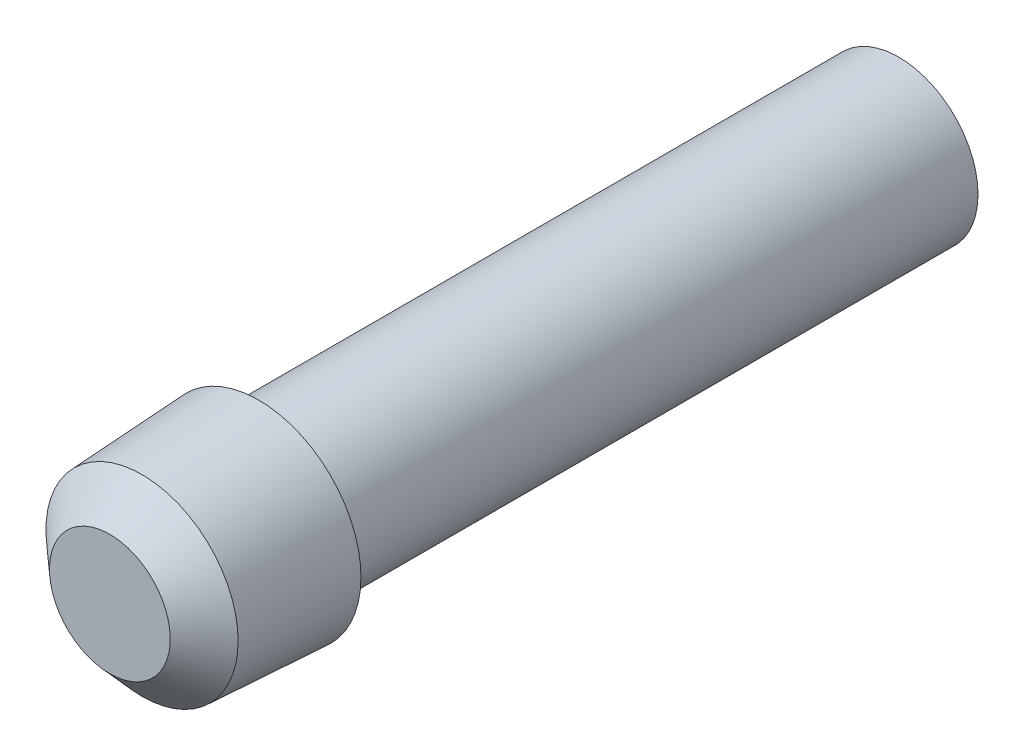
ISO-10303-21;
HEADER;
FILE_DESCRIPTION(('STEP AP214'),'2;1');
FILE_NAME('part.step','',(''),(''),'','','');
FILE_SCHEMA(('AUTOMOTIVE_DESIGN { 1 0 10303 214 1 1 1 1 }'));
ENDSEC;
DATA;
#1=APPLICATION_CONTEXT('core data for automotive mechanical design processes');
#2=APPLICATION_PROTOCOL_DEFINITION('international standard','automotive_design',2000,#1);
#3=PRODUCT_CONTEXT('',#1,'mechanical');
#4=PRODUCT('Part','Part','',(#3));
#5=PRODUCT_RELATED_PRODUCT_CATEGORY('part','',(#4));
#6=PRODUCT_DEFINITION_FORMATION('','',#4);
#7=PRODUCT_DEFINITION_CONTEXT('part definition',#1,'design');
#8=PRODUCT_DEFINITION('design','',#6,#7);
#9=PRODUCT_DEFINITION_SHAPE('','',#8);
#10=(LENGTH_UNIT() NAMED_UNIT(*) SI_UNIT(.MILLI.,.METRE.));
#11=(NAMED_UNIT(*) PLANE_ANGLE_UNIT() SI_UNIT($,.RADIAN.));
#12=(NAMED_UNIT(*) SI_UNIT($,.STERADIAN.) SOLID_ANGLE_UNIT());
#13=UNCERTAINTY_MEASURE_WITH_UNIT(LENGTH_MEASURE(1.E-05),#10,'distance_accuracy_value','');
#14=(GEOMETRIC_REPRESENTATION_CONTEXT(3) GLOBAL_UNCERTAINTY_ASSIGNED_CONTEXT((#13)) GLOBAL_UNIT_ASSIGNED_CONTEXT((#10,
#11,#12)) REPRESENTATION_CONTEXT('',''));
#15=CARTESIAN_POINT('',(0.,0.,0.));
#16=DIRECTION('',(0.,0.,1.));
#17=DIRECTION('',(1.,0.,0.));
#18=AXIS2_PLACEMENT_3D('',#15,#16,#17);
#19=CARTESIAN_POINT('',(0.,6.00969038201323,15.9855339059327));
#20=DIRECTION('',(0.,0.,-1.));
#21=DIRECTION('',(-1.,0.,0.));
#22=AXIS2_PLACEMENT_3D('',#19,#20,#21);
#23=CYLINDRICAL_SURFACE('',#22,1.25);
#24=CARTESIAN_POINT('',(0.,6.00969038201323,0.));
#25=DIRECTION('',(0.,0.,1.));
#26=DIRECTION('',(1.,0.,0.));
#27=AXIS2_PLACEMENT_3D('',#24,#25,#26);
#28=CIRCLE('',#27,1.25);
#29=CARTESIAN_POINT('',(1.25,6.00969038201323,0.));
#30=VERTEX_POINT('',#29);
#31=EDGE_CURVE('E57',#30,#30,#28,.T.);
#32=ORIENTED_EDGE('',*,*,#31,.T.);
#33=EDGE_LOOP('',(#32));
#34=FACE_BOUND('',#33,.T.);
#35=CARTESIAN_POINT('',(0.,6.00969038201323,10.1005));
#36=DIRECTION('',(0.,0.,1.));
#37=DIRECTION('',(1.,0.,0.));
#38=AXIS2_PLACEMENT_3D('',#35,#36,#37);
#39=CIRCLE('',#38,1.25);
#40=CARTESIAN_POINT('',(1.25,6.00969038201323,10.1005));
#41=VERTEX_POINT('',#40);
#42=EDGE_CURVE('E54',#41,#41,#39,.T.);
#43=ORIENTED_EDGE('',*,*,#42,.F.);
#44=EDGE_LOOP('',(#43));
#45=FACE_BOUND('',#44,.T.);
#46=ADVANCED_FACE('F33',(#34,#45),#23,.T.);
#47=CARTESIAN_POINT('',(0.,6.00969038201323,0.));
#48=DIRECTION('',(0.,0.,1.));
#49=DIRECTION('',(1.,0.,0.));
#50=AXIS2_PLACEMENT_3D('',#47,#48,#49);
#51=CONICAL_SURFACE('',#50,0.7,0.0349065850398867);
#52=CARTESIAN_POINT('',(0.,6.00969038201323,0.507690540125703));
#53=DIRECTION('',(0.,0.,1.));
#54=DIRECTION('',(1.,0.,0.));
#55=AXIS2_PLACEMENT_3D('',#52,#53,#54);
#56=CIRCLE('',#55,0.717728944324871);
#57=CARTESIAN_POINT('',(0.717728944324871,6.00969038201323,0.507690540125703));
#58=VERTEX_POINT('',#57);
#59=EDGE_CURVE('E45',#58,#58,#56,.F.);
#60=ORIENTED_EDGE('',*,*,#59,.T.);
#61=EDGE_LOOP('',(#60));
#62=FACE_BOUND('',#61,.T.);
#63=CARTESIAN_POINT('',(0.,6.00969038201323,9.275));
#64=DIRECTION('',(0.,0.,1.));
#65=DIRECTION('',(1.,0.,0.));
#66=AXIS2_PLACEMENT_3D('',#63,#64,#65);
#67=CIRCLE('',#66,1.02389013703596);
#68=CARTESIAN_POINT('',(1.02389013703596,6.00969038201323,9.275));
#69=VERTEX_POINT('',#68);
#70=EDGE_CURVE('E58',#69,#69,#67,.T.);
#71=ORIENTED_EDGE('',*,*,#70,.T.);
#72=EDGE_LOOP('',(#71));
#73=FACE_BOUND('',#72,.T.);
#74=ADVANCED_FACE('F84',(#62,#73),#51,.F.);
#75=CARTESIAN_POINT('',(0.,6.00969038201323,0.));
#76=DIRECTION('',(0.,0.,1.));
#77=DIRECTION('',(1.,0.,0.));
#78=AXIS2_PLACEMENT_3D('',#75,#76,#77);
#79=PLANE('',#78);
#80=CARTESIAN_POINT('',(0.,6.00969038201323,0.));
#81=DIRECTION('',(0.,0.,1.));
#82=DIRECTION('',(1.,0.,0.));
#83=AXIS2_PLACEMENT_3D('',#80,#81,#82);
#84=CIRCLE('',#83,1.19115803208147);
#85=CARTESIAN_POINT('',(1.19115803208147,6.00969038201323,0.));
#86=VERTEX_POINT('',#85);
#87=EDGE_CURVE('E49',#86,#86,#84,.T.);
#88=ORIENTED_EDGE('',*,*,#87,.T.);
#89=EDGE_LOOP('',(#88));
#90=FACE_BOUND('',#89,.T.);
#91=ORIENTED_EDGE('',*,*,#31,.F.);
#92=EDGE_LOOP('',(#91));
#93=FACE_BOUND('',#92,.T.);
#94=ADVANCED_FACE('F90',(#90,#93),#79,.F.);
#95=CARTESIAN_POINT('',(0.,6.00969038201323,9.275));
#96=DIRECTION('',(0.,0.,1.));
#97=DIRECTION('',(1.,0.,0.));
#98=AXIS2_PLACEMENT_3D('',#95,#96,#97);
#99=PLANE('',#98);
#100=ORIENTED_EDGE('',*,*,#70,.F.);
#101=EDGE_LOOP('',(#100));
#102=FACE_BOUND('',#101,.T.);
#103=ADVANCED_FACE('F80',(#102),#99,.F.);
#104=CARTESIAN_POINT('',(0.,6.00969038201323,10.1005));
#105=DIRECTION('',(0.,0.,-1.));
#106=DIRECTION('',(1.,0.,0.));
#107=AXIS2_PLACEMENT_3D('',#104,#105,#106);
#108=CONICAL_SURFACE('',#107,1.6129,0.05235987755983);
#109=CARTESIAN_POINT('',(0.,6.00969038201323,11.9426961963447));
#110=DIRECTION('',(0.,0.,1.));
#111=DIRECTION('',(0.,-1.,0.));
#112=AXIS2_PLACEMENT_3D('',#109,#110,#111);
#113=CIRCLE('',#112,1.51635458834591);
#114=CARTESIAN_POINT('',(0.,4.49333579366732,11.9426961963447));
#115=VERTEX_POINT('',#114);
#116=EDGE_CURVE('E10',#115,#115,#113,.F.);
#117=ORIENTED_EDGE('',*,*,#116,.T.);
#118=EDGE_LOOP('',(#117));
#119=FACE_BOUND('',#118,.T.);
#120=CARTESIAN_POINT('',(0.,6.00969038201323,10.1005));
#121=DIRECTION('',(0.,0.,1.));
#122=DIRECTION('',(1.,0.,0.));
#123=AXIS2_PLACEMENT_3D('',#120,#121,#122);
#124=CIRCLE('',#123,1.6129);
#125=CARTESIAN_POINT('',(1.6129,6.00969038201323,10.1005));
#126=VERTEX_POINT('',#125);
#127=EDGE_CURVE('E61',#126,#126,#124,.T.);
#128=ORIENTED_EDGE('',*,*,#127,.T.);
#129=EDGE_LOOP('',(#128));
#130=FACE_BOUND('',#129,.T.);
#131=ADVANCED_FACE('F67',(#119,#130),#108,.T.);
#132=CARTESIAN_POINT('',(0.,6.00969038201323,10.1005));
#133=DIRECTION('',(0.,0.,1.));
#134=DIRECTION('',(1.,0.,0.));
#135=AXIS2_PLACEMENT_3D('',#132,#133,#134);
#136=PLANE('',#135);
#137=ORIENTED_EDGE('',*,*,#42,.T.);
#138=EDGE_LOOP('',(#137));
#139=FACE_BOUND('',#138,.T.);
#140=ORIENTED_EDGE('',*,*,#127,.F.);
#141=EDGE_LOOP('',(#140));
#142=FACE_BOUND('',#141,.T.);
#143=ADVANCED_FACE('F69',(#139,#142),#136,.F.);
#144=CARTESIAN_POINT('',(0.,6.00969038201323,12.45));
#145=DIRECTION('',(0.,0.,1.));
#146=DIRECTION('',(0.207911690817756,-0.978147600733806,0.));
#147=AXIS2_PLACEMENT_3D('',#144,#145,#146);
#148=PLANE('',#147);
#149=CARTESIAN_POINT('',(0.,6.00969038201323,12.45));
#150=DIRECTION('',(0.,0.,1.));
#151=DIRECTION('',(0.,-1.,0.));
#152=AXIS2_PLACEMENT_3D('',#149,#150,#151);
#153=CIRCLE('',#152,0.952936635185853);
#154=CARTESIAN_POINT('',(0.,5.05675374682738,12.45));
#155=VERTEX_POINT('',#154);
#156=EDGE_CURVE('E41',#155,#155,#153,.T.);
#157=ORIENTED_EDGE('',*,*,#156,.T.);
#158=EDGE_LOOP('',(#157));
#159=FACE_BOUND('',#158,.T.);
#160=ADVANCED_FACE('F71',(#159),#148,.T.);
#161=CARTESIAN_POINT('',(0.,6.00969038201323,0.));
#162=DIRECTION('',(0.,0.,-1.));
#163=DIRECTION('',(-1.,0.,0.));
#164=AXIS2_PLACEMENT_3D('',#161,#162,#163);
#165=CONICAL_SURFACE('',#164,1.19115803208147,0.75049157835756);
#166=ORIENTED_EDGE('',*,*,#59,.F.);
#167=EDGE_LOOP('',(#166));
#168=FACE_BOUND('',#167,.T.);
#169=ORIENTED_EDGE('',*,*,#87,.F.);
#170=EDGE_LOOP('',(#169));
#171=FACE_BOUND('',#170,.T.);
#172=ADVANCED_FACE('F78',(#168,#171),#165,.F.);
#173=CARTESIAN_POINT('',(0.,6.00969038201323,12.45));
#174=DIRECTION('',(0.,0.,-1.));
#175=DIRECTION('',(0.,1.,0.));
#176=AXIS2_PLACEMENT_3D('',#173,#174,#175);
#177=CONICAL_SURFACE('',#176,0.952936635185852,0.837758040957279);
#178=ORIENTED_EDGE('',*,*,#116,.F.);
#179=EDGE_LOOP('',(#178));
#180=FACE_BOUND('',#179,.T.);
#181=ORIENTED_EDGE('',*,*,#156,.F.);
#182=EDGE_LOOP('',(#181));
#183=FACE_BOUND('',#182,.T.);
#184=ADVANCED_FACE('F36',(#180,#183),#177,.T.);
#185=CLOSED_SHELL('',(#46,#74,#94,#103,#131,#143,#160,#172,#184));
#186=MANIFOLD_SOLID_BREP('B2',#185);
#187=ADVANCED_BREP_SHAPE_REPRESENTATION('',(#18,#186),#14);
#188=SHAPE_DEFINITION_REPRESENTATION(#9,#187);
ENDSEC;
END-ISO-10303-21;
